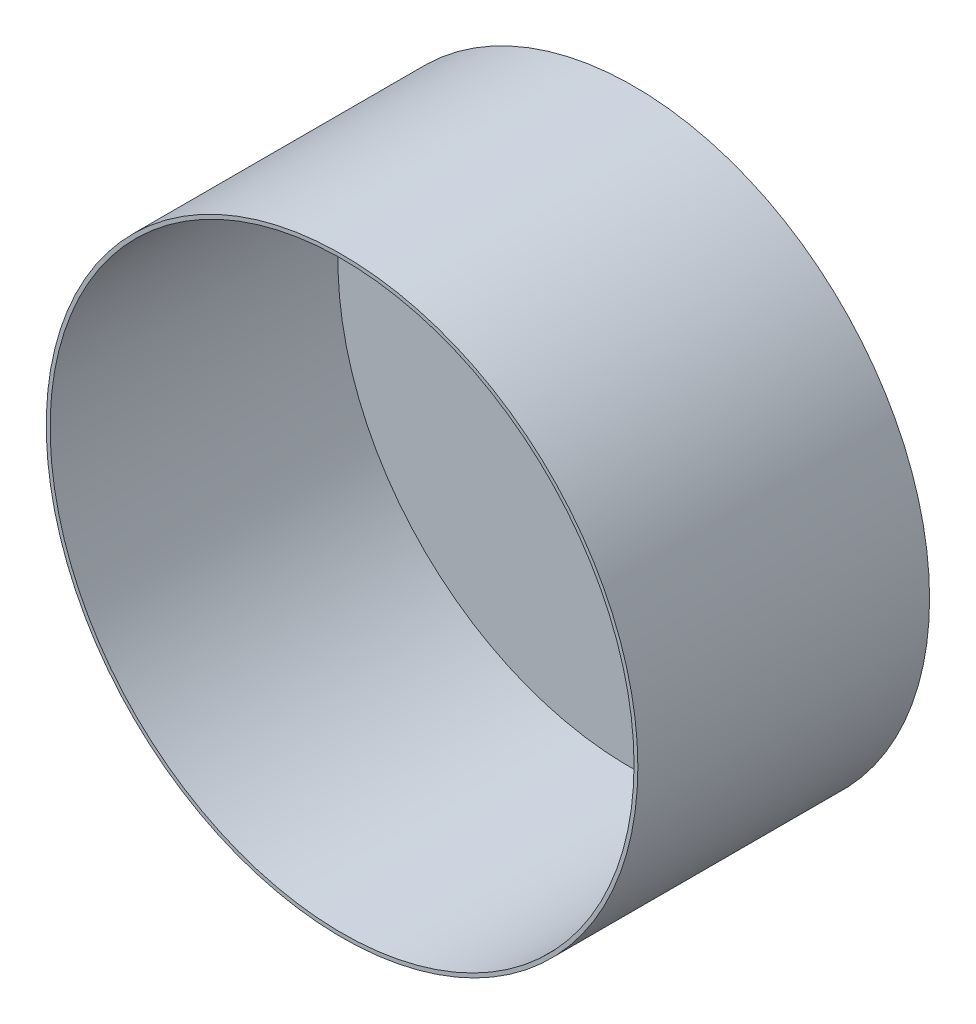
ISO-10303-21;
HEADER;
FILE_DESCRIPTION(('STEP AP214'),'2;1');
FILE_NAME('part.step','',(''),(''),'','','');
FILE_SCHEMA(('AUTOMOTIVE_DESIGN { 1 0 10303 214 1 1 1 1 }'));
ENDSEC;
DATA;
#1=APPLICATION_CONTEXT('core data for automotive mechanical design processes');
#2=APPLICATION_PROTOCOL_DEFINITION('international standard','automotive_design',2000,#1);
#3=PRODUCT_CONTEXT('',#1,'mechanical');
#4=PRODUCT('Part','Part','',(#3));
#5=PRODUCT_RELATED_PRODUCT_CATEGORY('part','',(#4));
#6=PRODUCT_DEFINITION_FORMATION('','',#4);
#7=PRODUCT_DEFINITION_CONTEXT('part definition',#1,'design');
#8=PRODUCT_DEFINITION('design','',#6,#7);
#9=PRODUCT_DEFINITION_SHAPE('','',#8);
#10=(LENGTH_UNIT() NAMED_UNIT(*) SI_UNIT(.MILLI.,.METRE.));
#11=(NAMED_UNIT(*) PLANE_ANGLE_UNIT() SI_UNIT($,.RADIAN.));
#12=(NAMED_UNIT(*) SI_UNIT($,.STERADIAN.) SOLID_ANGLE_UNIT());
#13=UNCERTAINTY_MEASURE_WITH_UNIT(LENGTH_MEASURE(1.E-05),#10,'distance_accuracy_value','');
#14=(GEOMETRIC_REPRESENTATION_CONTEXT(3) GLOBAL_UNCERTAINTY_ASSIGNED_CONTEXT((#13)) GLOBAL_UNIT_ASSIGNED_CONTEXT((#10,
#11,#12)) REPRESENTATION_CONTEXT('',''));
#15=CARTESIAN_POINT('',(0.,0.,0.));
#16=DIRECTION('',(0.,0.,1.));
#17=DIRECTION('',(1.,0.,0.));
#18=AXIS2_PLACEMENT_3D('',#15,#16,#17);
#19=CARTESIAN_POINT('',(0.,0.,38.));
#20=DIRECTION('',(0.,0.,-1.));
#21=DIRECTION('',(-1.,0.,0.));
#22=AXIS2_PLACEMENT_3D('',#19,#20,#21);
#23=CYLINDRICAL_SURFACE('',#22,38.535);
#24=CARTESIAN_POINT('',(0.,0.,38.));
#25=DIRECTION('',(0.,0.,1.));
#26=DIRECTION('',(1.,0.,0.));
#27=AXIS2_PLACEMENT_3D('',#24,#25,#26);
#28=CIRCLE('',#27,38.535);
#29=CARTESIAN_POINT('',(38.535,0.,38.));
#30=VERTEX_POINT('',#29);
#31=EDGE_CURVE('E10',#30,#30,#28,.T.);
#32=ORIENTED_EDGE('',*,*,#31,.F.);
#33=EDGE_LOOP('',(#32));
#34=FACE_BOUND('',#33,.T.);
#35=CARTESIAN_POINT('',(0.,0.,0.));
#36=DIRECTION('',(0.,0.,1.));
#37=DIRECTION('',(1.,0.,0.));
#38=AXIS2_PLACEMENT_3D('',#35,#36,#37);
#39=CIRCLE('',#38,38.535);
#40=CARTESIAN_POINT('',(38.535,0.,0.));
#41=VERTEX_POINT('',#40);
#42=EDGE_CURVE('E46',#41,#41,#39,.T.);
#43=ORIENTED_EDGE('',*,*,#42,.T.);
#44=EDGE_LOOP('',(#43));
#45=FACE_BOUND('',#44,.T.);
#46=ADVANCED_FACE('F43',(#34,#45),#23,.T.);
#47=CARTESIAN_POINT('',(0.,0.,38.));
#48=DIRECTION('',(0.,0.,1.));
#49=DIRECTION('',(1.,0.,0.));
#50=AXIS2_PLACEMENT_3D('',#47,#48,#49);
#51=PLANE('',#50);
#52=CARTESIAN_POINT('',(0.,0.,38.));
#53=DIRECTION('',(0.,0.,1.));
#54=DIRECTION('',(1.,0.,0.));
#55=AXIS2_PLACEMENT_3D('',#52,#53,#54);
#56=CIRCLE('',#55,38.035);
#57=CARTESIAN_POINT('',(38.035,0.,38.));
#58=VERTEX_POINT('',#57);
#59=EDGE_CURVE('E57',#58,#58,#56,.T.);
#60=ORIENTED_EDGE('',*,*,#59,.F.);
#61=EDGE_LOOP('',(#60));
#62=FACE_BOUND('',#61,.T.);
#63=ORIENTED_EDGE('',*,*,#31,.T.);
#64=EDGE_LOOP('',(#63));
#65=FACE_BOUND('',#64,.T.);
#66=ADVANCED_FACE('F74',(#62,#65),#51,.T.);
#67=CARTESIAN_POINT('',(0.,0.,0.));
#68=DIRECTION('',(0.,0.,1.));
#69=DIRECTION('',(1.,0.,0.));
#70=AXIS2_PLACEMENT_3D('',#67,#68,#69);
#71=PLANE('',#70);
#72=ORIENTED_EDGE('',*,*,#42,.F.);
#73=EDGE_LOOP('',(#72));
#74=FACE_BOUND('',#73,.T.);
#75=ADVANCED_FACE('F70',(#74),#71,.F.);
#76=CARTESIAN_POINT('',(0.,0.,0.5));
#77=DIRECTION('',(0.,0.,1.));
#78=DIRECTION('',(1.,0.,0.));
#79=AXIS2_PLACEMENT_3D('',#76,#77,#78);
#80=CYLINDRICAL_SURFACE('',#79,38.035);
#81=CARTESIAN_POINT('',(0.,0.,0.5));
#82=DIRECTION('',(0.,0.,1.));
#83=DIRECTION('',(1.,0.,0.));
#84=AXIS2_PLACEMENT_3D('',#81,#82,#83);
#85=CIRCLE('',#84,38.035);
#86=CARTESIAN_POINT('',(38.035,0.,0.5));
#87=VERTEX_POINT('',#86);
#88=EDGE_CURVE('E55',#87,#87,#85,.T.);
#89=ORIENTED_EDGE('',*,*,#88,.F.);
#90=EDGE_LOOP('',(#89));
#91=FACE_BOUND('',#90,.T.);
#92=ORIENTED_EDGE('',*,*,#59,.T.);
#93=EDGE_LOOP('',(#92));
#94=FACE_BOUND('',#93,.T.);
#95=ADVANCED_FACE('F67',(#91,#94),#80,.F.);
#96=CARTESIAN_POINT('',(0.,0.,0.5));
#97=DIRECTION('',(0.,0.,1.));
#98=DIRECTION('',(1.,0.,0.));
#99=AXIS2_PLACEMENT_3D('',#96,#97,#98);
#100=PLANE('',#99);
#101=ORIENTED_EDGE('',*,*,#88,.T.);
#102=EDGE_LOOP('',(#101));
#103=FACE_BOUND('',#102,.T.);
#104=ADVANCED_FACE('F65',(#103),#100,.T.);
#105=CLOSED_SHELL('',(#46,#66,#75,#95,#104));
#106=MANIFOLD_SOLID_BREP('B2',#105);
#107=ADVANCED_BREP_SHAPE_REPRESENTATION('',(#18,#106),#14);
#108=SHAPE_DEFINITION_REPRESENTATION(#9,#107);
ENDSEC;
END-ISO-10303-21;
